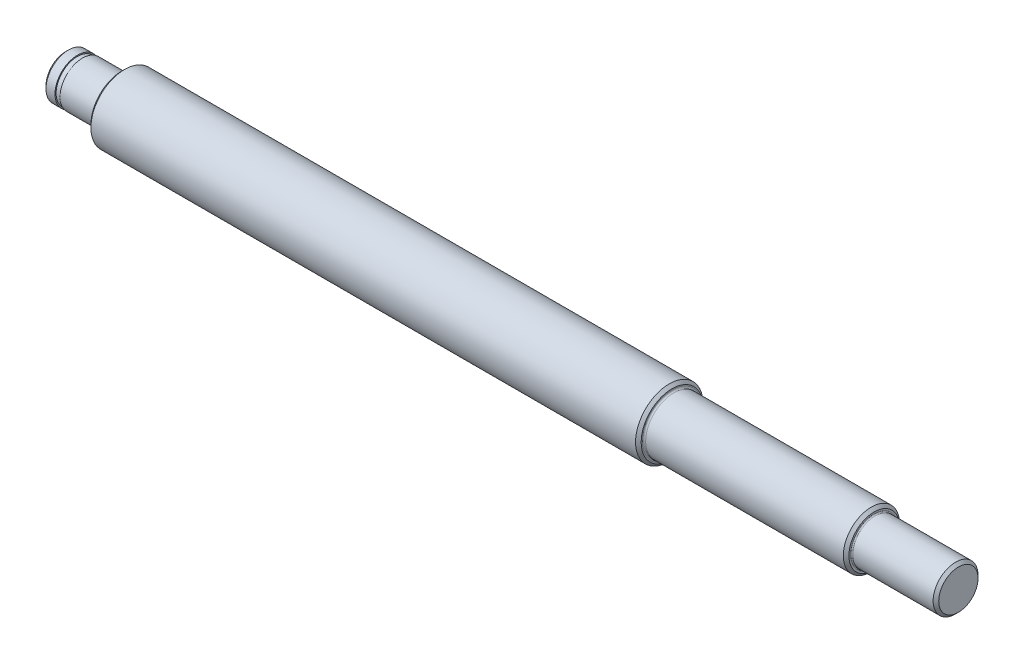
ISO-10303-21;
HEADER;
FILE_DESCRIPTION(('STEP AP214'),'2;1');
FILE_NAME('part.step','',(''),(''),'','','');
FILE_SCHEMA(('AUTOMOTIVE_DESIGN { 1 0 10303 214 1 1 1 1 }'));
ENDSEC;
DATA;
#1=APPLICATION_CONTEXT('core data for automotive mechanical design processes');
#2=APPLICATION_PROTOCOL_DEFINITION('international standard','automotive_design',2000,#1);
#3=PRODUCT_CONTEXT('',#1,'mechanical');
#4=PRODUCT('Part','Part','',(#3));
#5=PRODUCT_RELATED_PRODUCT_CATEGORY('part','',(#4));
#6=PRODUCT_DEFINITION_FORMATION('','',#4);
#7=PRODUCT_DEFINITION_CONTEXT('part definition',#1,'design');
#8=PRODUCT_DEFINITION('design','',#6,#7);
#9=PRODUCT_DEFINITION_SHAPE('','',#8);
#10=(LENGTH_UNIT() NAMED_UNIT(*) SI_UNIT(.MILLI.,.METRE.));
#11=(NAMED_UNIT(*) PLANE_ANGLE_UNIT() SI_UNIT($,.RADIAN.));
#12=(NAMED_UNIT(*) SI_UNIT($,.STERADIAN.) SOLID_ANGLE_UNIT());
#13=UNCERTAINTY_MEASURE_WITH_UNIT(LENGTH_MEASURE(1.E-05),#10,'distance_accuracy_value','');
#14=(GEOMETRIC_REPRESENTATION_CONTEXT(3) GLOBAL_UNCERTAINTY_ASSIGNED_CONTEXT((#13)) GLOBAL_UNIT_ASSIGNED_CONTEXT((#10,
#11,#12)) REPRESENTATION_CONTEXT('',''));
#15=CARTESIAN_POINT('',(0.,0.,0.));
#16=DIRECTION('',(0.,0.,1.));
#17=DIRECTION('',(1.,0.,0.));
#18=AXIS2_PLACEMENT_3D('',#15,#16,#17);
#19=CARTESIAN_POINT('',(0.500000000000004,0.,0.));
#20=DIRECTION('',(1.,0.,0.));
#21=DIRECTION('',(0.,0.,-1.));
#22=AXIS2_PLACEMENT_3D('',#19,#20,#21);
#23=CONICAL_SURFACE('',#22,4.,0.785398163397417);
#24=CARTESIAN_POINT('',(0.,0.,0.));
#25=DIRECTION('',(-1.,0.,0.));
#26=DIRECTION('',(0.,0.,1.));
#27=AXIS2_PLACEMENT_3D('',#24,#25,#26);
#28=CIRCLE('',#27,3.50000000000003);
#29=CARTESIAN_POINT('',(0.,0.,3.50000000000003));
#30=VERTEX_POINT('',#29);
#31=EDGE_CURVE('E105',#30,#30,#28,.T.);
#32=ORIENTED_EDGE('',*,*,#31,.F.);
#33=EDGE_LOOP('',(#32));
#34=FACE_BOUND('',#33,.T.);
#35=CARTESIAN_POINT('',(0.500000000000004,0.,0.));
#36=DIRECTION('',(-1.,0.,0.));
#37=DIRECTION('',(0.,0.,1.));
#38=AXIS2_PLACEMENT_3D('',#35,#36,#37);
#39=CIRCLE('',#38,4.);
#40=CARTESIAN_POINT('',(0.500000000000004,0.,4.));
#41=VERTEX_POINT('',#40);
#42=EDGE_CURVE('E10',#41,#41,#39,.T.);
#43=ORIENTED_EDGE('',*,*,#42,.T.);
#44=EDGE_LOOP('',(#43));
#45=FACE_BOUND('',#44,.T.);
#46=ADVANCED_FACE('F41',(#34,#45),#23,.T.);
#47=CARTESIAN_POINT('',(-7.49999999999999,0.,0.));
#48=DIRECTION('',(-1.,0.,0.));
#49=DIRECTION('',(0.,0.,1.));
#50=AXIS2_PLACEMENT_3D('',#47,#48,#49);
#51=CYLINDRICAL_SURFACE('',#50,4.);
#52=ORIENTED_EDGE('',*,*,#42,.F.);
#53=EDGE_LOOP('',(#52));
#54=FACE_BOUND('',#53,.T.);
#55=CARTESIAN_POINT('',(2.10000000000001,0.,0.));
#56=DIRECTION('',(-1.,0.,0.));
#57=DIRECTION('',(0.,0.,1.));
#58=AXIS2_PLACEMENT_3D('',#55,#56,#57);
#59=CIRCLE('',#58,4.);
#60=CARTESIAN_POINT('',(2.10000000000001,0.,4.));
#61=VERTEX_POINT('',#60);
#62=EDGE_CURVE('E47',#61,#61,#59,.T.);
#63=ORIENTED_EDGE('',*,*,#62,.T.);
#64=EDGE_LOOP('',(#63));
#65=FACE_BOUND('',#64,.T.);
#66=ADVANCED_FACE('F112',(#54,#65),#51,.T.);
#67=CARTESIAN_POINT('',(2.10000000000001,4.,0.));
#68=DIRECTION('',(-1.,0.,0.));
#69=DIRECTION('',(0.,0.,1.));
#70=AXIS2_PLACEMENT_3D('',#67,#68,#69);
#71=PLANE('',#70);
#72=ORIENTED_EDGE('',*,*,#62,.F.);
#73=EDGE_LOOP('',(#72));
#74=FACE_BOUND('',#73,.T.);
#75=CARTESIAN_POINT('',(2.10000000000001,0.,0.));
#76=DIRECTION('',(-1.,0.,0.));
#77=DIRECTION('',(0.,0.,1.));
#78=AXIS2_PLACEMENT_3D('',#75,#76,#77);
#79=CIRCLE('',#78,3.8);
#80=CARTESIAN_POINT('',(2.10000000000001,0.,3.8));
#81=VERTEX_POINT('',#80);
#82=EDGE_CURVE('E51',#81,#81,#79,.T.);
#83=ORIENTED_EDGE('',*,*,#82,.T.);
#84=EDGE_LOOP('',(#83));
#85=FACE_BOUND('',#84,.T.);
#86=ADVANCED_FACE('F116',(#74,#85),#71,.F.);
#87=CARTESIAN_POINT('',(-7.49999999999999,0.,0.));
#88=DIRECTION('',(-1.,0.,0.));
#89=DIRECTION('',(0.,0.,1.));
#90=AXIS2_PLACEMENT_3D('',#87,#88,#89);
#91=CYLINDRICAL_SURFACE('',#90,3.8);
#92=ORIENTED_EDGE('',*,*,#82,.F.);
#93=EDGE_LOOP('',(#92));
#94=FACE_BOUND('',#93,.T.);
#95=CARTESIAN_POINT('',(3.00000000000001,0.,0.));
#96=DIRECTION('',(-1.,0.,0.));
#97=DIRECTION('',(0.,0.,1.));
#98=AXIS2_PLACEMENT_3D('',#95,#96,#97);
#99=CIRCLE('',#98,3.8);
#100=CARTESIAN_POINT('',(3.00000000000001,0.,3.8));
#101=VERTEX_POINT('',#100);
#102=EDGE_CURVE('E55',#101,#101,#99,.T.);
#103=ORIENTED_EDGE('',*,*,#102,.T.);
#104=EDGE_LOOP('',(#103));
#105=FACE_BOUND('',#104,.T.);
#106=ADVANCED_FACE('F121',(#94,#105),#91,.T.);
#107=CARTESIAN_POINT('',(3.00000000000001,4.,0.));
#108=DIRECTION('',(1.,0.,0.));
#109=DIRECTION('',(0.,0.,-1.));
#110=AXIS2_PLACEMENT_3D('',#107,#108,#109);
#111=PLANE('',#110);
#112=ORIENTED_EDGE('',*,*,#102,.F.);
#113=EDGE_LOOP('',(#112));
#114=FACE_BOUND('',#113,.T.);
#115=CARTESIAN_POINT('',(3.00000000000001,0.,0.));
#116=DIRECTION('',(-1.,0.,0.));
#117=DIRECTION('',(0.,0.,1.));
#118=AXIS2_PLACEMENT_3D('',#115,#116,#117);
#119=CIRCLE('',#118,4.);
#120=CARTESIAN_POINT('',(3.00000000000001,0.,4.));
#121=VERTEX_POINT('',#120);
#122=EDGE_CURVE('E60',#121,#121,#119,.T.);
#123=ORIENTED_EDGE('',*,*,#122,.T.);
#124=EDGE_LOOP('',(#123));
#125=FACE_BOUND('',#124,.T.);
#126=ADVANCED_FACE('F127',(#114,#125),#111,.F.);
#127=CARTESIAN_POINT('',(-7.49999999999999,0.,0.));
#128=DIRECTION('',(-1.,0.,0.));
#129=DIRECTION('',(0.,0.,1.));
#130=AXIS2_PLACEMENT_3D('',#127,#128,#129);
#131=CYLINDRICAL_SURFACE('',#130,4.);
#132=ORIENTED_EDGE('',*,*,#122,.F.);
#133=EDGE_LOOP('',(#132));
#134=FACE_BOUND('',#133,.T.);
#135=CARTESIAN_POINT('',(9.70000000000001,0.,0.));
#136=DIRECTION('',(-1.,0.,0.));
#137=DIRECTION('',(0.,0.,1.));
#138=AXIS2_PLACEMENT_3D('',#135,#136,#137);
#139=CIRCLE('',#138,4.);
#140=CARTESIAN_POINT('',(9.70000000000001,0.,4.));
#141=VERTEX_POINT('',#140);
#142=EDGE_CURVE('E63',#141,#141,#139,.T.);
#143=ORIENTED_EDGE('',*,*,#142,.T.);
#144=EDGE_LOOP('',(#143));
#145=FACE_BOUND('',#144,.T.);
#146=ADVANCED_FACE('F131',(#134,#145),#131,.T.);
#147=CARTESIAN_POINT('',(9.70000000000001,0.,0.));
#148=DIRECTION('',(-1.,0.,0.));
#149=DIRECTION('',(0.,0.,1.));
#150=AXIS2_PLACEMENT_3D('',#147,#148,#149);
#151=TOROIDAL_SURFACE('',#150,4.3,0.3);
#152=ORIENTED_EDGE('',*,*,#142,.F.);
#153=EDGE_LOOP('',(#152));
#154=FACE_BOUND('',#153,.T.);
#155=CARTESIAN_POINT('',(10.,0.,0.));
#156=DIRECTION('',(-1.,0.,0.));
#157=DIRECTION('',(0.,0.,1.));
#158=AXIS2_PLACEMENT_3D('',#155,#156,#157);
#159=CIRCLE('',#158,4.3);
#160=CARTESIAN_POINT('',(10.,0.,4.3));
#161=VERTEX_POINT('',#160);
#162=EDGE_CURVE('E66',#161,#161,#159,.T.);
#163=ORIENTED_EDGE('',*,*,#162,.T.);
#164=EDGE_LOOP('',(#163));
#165=FACE_BOUND('',#164,.T.);
#166=ADVANCED_FACE('F135',(#154,#165),#151,.F.);
#167=CARTESIAN_POINT('',(10.,5.50000000000002,0.));
#168=DIRECTION('',(1.,0.,0.));
#169=DIRECTION('',(0.,0.,-1.));
#170=AXIS2_PLACEMENT_3D('',#167,#168,#169);
#171=PLANE('',#170);
#172=ORIENTED_EDGE('',*,*,#162,.F.);
#173=EDGE_LOOP('',(#172));
#174=FACE_BOUND('',#173,.T.);
#175=CARTESIAN_POINT('',(10.,0.,0.));
#176=DIRECTION('',(-1.,0.,0.));
#177=DIRECTION('',(0.,0.,1.));
#178=AXIS2_PLACEMENT_3D('',#175,#176,#177);
#179=CIRCLE('',#178,5.50000000000002);
#180=CARTESIAN_POINT('',(10.,0.,5.50000000000002));
#181=VERTEX_POINT('',#180);
#182=EDGE_CURVE('E69',#181,#181,#179,.T.);
#183=ORIENTED_EDGE('',*,*,#182,.T.);
#184=EDGE_LOOP('',(#183));
#185=FACE_BOUND('',#184,.T.);
#186=ADVANCED_FACE('F139',(#174,#185),#171,.F.);
#187=CARTESIAN_POINT('',(10.5,0.,0.));
#188=DIRECTION('',(1.,0.,0.));
#189=DIRECTION('',(0.,0.,-1.));
#190=AXIS2_PLACEMENT_3D('',#187,#188,#189);
#191=CONICAL_SURFACE('',#190,5.99999999999999,0.785398163397423);
#192=ORIENTED_EDGE('',*,*,#182,.F.);
#193=EDGE_LOOP('',(#192));
#194=FACE_BOUND('',#193,.T.);
#195=CARTESIAN_POINT('',(10.5,0.,0.));
#196=DIRECTION('',(-1.,0.,0.));
#197=DIRECTION('',(0.,0.,1.));
#198=AXIS2_PLACEMENT_3D('',#195,#196,#197);
#199=CIRCLE('',#198,5.99999999999999);
#200=CARTESIAN_POINT('',(10.5,0.,5.99999999999999));
#201=VERTEX_POINT('',#200);
#202=EDGE_CURVE('E72',#201,#201,#199,.T.);
#203=ORIENTED_EDGE('',*,*,#202,.T.);
#204=EDGE_LOOP('',(#203));
#205=FACE_BOUND('',#204,.T.);
#206=ADVANCED_FACE('F143',(#194,#205),#191,.T.);
#207=CARTESIAN_POINT('',(-7.49999999999999,0.,0.));
#208=DIRECTION('',(-1.,0.,0.));
#209=DIRECTION('',(0.,0.,1.));
#210=AXIS2_PLACEMENT_3D('',#207,#208,#209);
#211=CYLINDRICAL_SURFACE('',#210,6.00000000000001);
#212=ORIENTED_EDGE('',*,*,#202,.F.);
#213=EDGE_LOOP('',(#212));
#214=FACE_BOUND('',#213,.T.);
#215=CARTESIAN_POINT('',(107.5,0.,0.));
#216=DIRECTION('',(-1.,0.,0.));
#217=DIRECTION('',(0.,0.,1.));
#218=AXIS2_PLACEMENT_3D('',#215,#216,#217);
#219=CIRCLE('',#218,6.00000000000002);
#220=CARTESIAN_POINT('',(107.5,0.,6.00000000000002));
#221=VERTEX_POINT('',#220);
#222=EDGE_CURVE('E75',#221,#221,#219,.T.);
#223=ORIENTED_EDGE('',*,*,#222,.T.);
#224=EDGE_LOOP('',(#223));
#225=FACE_BOUND('',#224,.T.);
#226=ADVANCED_FACE('F147',(#214,#225),#211,.T.);
#227=CARTESIAN_POINT('',(108.,0.,0.));
#228=DIRECTION('',(-1.,0.,0.));
#229=DIRECTION('',(0.,0.,1.));
#230=AXIS2_PLACEMENT_3D('',#227,#228,#229);
#231=CONICAL_SURFACE('',#230,5.49999999999999,0.785398163397479);
#232=ORIENTED_EDGE('',*,*,#222,.F.);
#233=EDGE_LOOP('',(#232));
#234=FACE_BOUND('',#233,.T.);
#235=CARTESIAN_POINT('',(108.,0.,0.));
#236=DIRECTION('',(-1.,0.,0.));
#237=DIRECTION('',(0.,0.,1.));
#238=AXIS2_PLACEMENT_3D('',#235,#236,#237);
#239=CIRCLE('',#238,5.49999999999999);
#240=CARTESIAN_POINT('',(108.,0.,5.49999999999999));
#241=VERTEX_POINT('',#240);
#242=EDGE_CURVE('E78',#241,#241,#239,.T.);
#243=ORIENTED_EDGE('',*,*,#242,.T.);
#244=EDGE_LOOP('',(#243));
#245=FACE_BOUND('',#244,.T.);
#246=ADVANCED_FACE('F151',(#234,#245),#231,.T.);
#247=CARTESIAN_POINT('',(108.,5.30000000000001,0.));
#248=DIRECTION('',(-1.,0.,0.));
#249=DIRECTION('',(0.,0.,1.));
#250=AXIS2_PLACEMENT_3D('',#247,#248,#249);
#251=PLANE('',#250);
#252=ORIENTED_EDGE('',*,*,#242,.F.);
#253=EDGE_LOOP('',(#252));
#254=FACE_BOUND('',#253,.T.);
#255=CARTESIAN_POINT('',(108.,0.,0.));
#256=DIRECTION('',(-1.,0.,0.));
#257=DIRECTION('',(0.,0.,1.));
#258=AXIS2_PLACEMENT_3D('',#255,#256,#257);
#259=CIRCLE('',#258,5.30000000000001);
#260=CARTESIAN_POINT('',(108.,0.,5.30000000000001));
#261=VERTEX_POINT('',#260);
#262=EDGE_CURVE('E81',#261,#261,#259,.T.);
#263=ORIENTED_EDGE('',*,*,#262,.T.);
#264=EDGE_LOOP('',(#263));
#265=FACE_BOUND('',#264,.T.);
#266=ADVANCED_FACE('F155',(#254,#265),#251,.F.);
#267=CARTESIAN_POINT('',(108.3,0.,0.));
#268=DIRECTION('',(-1.,0.,0.));
#269=DIRECTION('',(0.,0.,1.));
#270=AXIS2_PLACEMENT_3D('',#267,#268,#269);
#271=TOROIDAL_SURFACE('',#270,5.30000000000001,0.299999999999998);
#272=ORIENTED_EDGE('',*,*,#262,.F.);
#273=EDGE_LOOP('',(#272));
#274=FACE_BOUND('',#273,.T.);
#275=CARTESIAN_POINT('',(108.3,0.,0.));
#276=DIRECTION('',(-1.,0.,0.));
#277=DIRECTION('',(0.,0.,1.));
#278=AXIS2_PLACEMENT_3D('',#275,#276,#277);
#279=CIRCLE('',#278,5.00000000000001);
#280=CARTESIAN_POINT('',(108.3,0.,5.00000000000001));
#281=VERTEX_POINT('',#280);
#282=EDGE_CURVE('E84',#281,#281,#279,.T.);
#283=ORIENTED_EDGE('',*,*,#282,.T.);
#284=EDGE_LOOP('',(#283));
#285=FACE_BOUND('',#284,.T.);
#286=ADVANCED_FACE('F159',(#274,#285),#271,.F.);
#287=CARTESIAN_POINT('',(-7.49999999999999,0.,0.));
#288=DIRECTION('',(-1.,0.,0.));
#289=DIRECTION('',(0.,0.,1.));
#290=AXIS2_PLACEMENT_3D('',#287,#288,#289);
#291=CYLINDRICAL_SURFACE('',#290,5.00000000000003);
#292=ORIENTED_EDGE('',*,*,#282,.F.);
#293=EDGE_LOOP('',(#292));
#294=FACE_BOUND('',#293,.T.);
#295=CARTESIAN_POINT('',(143.5,0.,0.));
#296=DIRECTION('',(-1.,0.,0.));
#297=DIRECTION('',(0.,0.,1.));
#298=AXIS2_PLACEMENT_3D('',#295,#296,#297);
#299=CIRCLE('',#298,5.00000000000004);
#300=CARTESIAN_POINT('',(143.5,0.,5.00000000000004));
#301=VERTEX_POINT('',#300);
#302=EDGE_CURVE('E87',#301,#301,#299,.T.);
#303=ORIENTED_EDGE('',*,*,#302,.T.);
#304=EDGE_LOOP('',(#303));
#305=FACE_BOUND('',#304,.T.);
#306=ADVANCED_FACE('F163',(#294,#305),#291,.T.);
#307=CARTESIAN_POINT('',(144.,0.,0.));
#308=DIRECTION('',(-1.,0.,0.));
#309=DIRECTION('',(0.,0.,1.));
#310=AXIS2_PLACEMENT_3D('',#307,#308,#309);
#311=CONICAL_SURFACE('',#310,4.50000000000001,0.785398163397482);
#312=ORIENTED_EDGE('',*,*,#302,.F.);
#313=EDGE_LOOP('',(#312));
#314=FACE_BOUND('',#313,.T.);
#315=CARTESIAN_POINT('',(144.,0.,0.));
#316=DIRECTION('',(-1.,0.,0.));
#317=DIRECTION('',(0.,0.,1.));
#318=AXIS2_PLACEMENT_3D('',#315,#316,#317);
#319=CIRCLE('',#318,4.50000000000001);
#320=CARTESIAN_POINT('',(144.,0.,4.50000000000001));
#321=VERTEX_POINT('',#320);
#322=EDGE_CURVE('E90',#321,#321,#319,.T.);
#323=ORIENTED_EDGE('',*,*,#322,.T.);
#324=EDGE_LOOP('',(#323));
#325=FACE_BOUND('',#324,.T.);
#326=ADVANCED_FACE('F167',(#314,#325),#311,.T.);
#327=CARTESIAN_POINT('',(144.,4.20000000000002,0.));
#328=DIRECTION('',(-1.,0.,0.));
#329=DIRECTION('',(0.,0.,1.));
#330=AXIS2_PLACEMENT_3D('',#327,#328,#329);
#331=PLANE('',#330);
#332=ORIENTED_EDGE('',*,*,#322,.F.);
#333=EDGE_LOOP('',(#332));
#334=FACE_BOUND('',#333,.T.);
#335=CARTESIAN_POINT('',(144.,0.,0.));
#336=DIRECTION('',(-1.,0.,0.));
#337=DIRECTION('',(0.,0.,1.));
#338=AXIS2_PLACEMENT_3D('',#335,#336,#337);
#339=CIRCLE('',#338,4.20000000000002);
#340=CARTESIAN_POINT('',(144.,0.,4.20000000000002));
#341=VERTEX_POINT('',#340);
#342=EDGE_CURVE('E93',#341,#341,#339,.T.);
#343=ORIENTED_EDGE('',*,*,#342,.T.);
#344=EDGE_LOOP('',(#343));
#345=FACE_BOUND('',#344,.T.);
#346=ADVANCED_FACE('F171',(#334,#345),#331,.F.);
#347=CARTESIAN_POINT('',(144.2,0.,0.));
#348=DIRECTION('',(-1.,0.,0.));
#349=DIRECTION('',(0.,0.,1.));
#350=AXIS2_PLACEMENT_3D('',#347,#348,#349);
#351=TOROIDAL_SURFACE('',#350,4.20000000000002,0.200000000000002);
#352=ORIENTED_EDGE('',*,*,#342,.F.);
#353=EDGE_LOOP('',(#352));
#354=FACE_BOUND('',#353,.T.);
#355=CARTESIAN_POINT('',(144.2,0.,0.));
#356=DIRECTION('',(-1.,0.,0.));
#357=DIRECTION('',(0.,0.,1.));
#358=AXIS2_PLACEMENT_3D('',#355,#356,#357);
#359=CIRCLE('',#358,4.00000000000002);
#360=CARTESIAN_POINT('',(144.2,0.,4.00000000000002));
#361=VERTEX_POINT('',#360);
#362=EDGE_CURVE('E96',#361,#361,#359,.T.);
#363=ORIENTED_EDGE('',*,*,#362,.T.);
#364=EDGE_LOOP('',(#363));
#365=FACE_BOUND('',#364,.T.);
#366=ADVANCED_FACE('F175',(#354,#365),#351,.F.);
#367=CARTESIAN_POINT('',(-7.49999999999999,0.,0.));
#368=DIRECTION('',(-1.,0.,0.));
#369=DIRECTION('',(0.,0.,1.));
#370=AXIS2_PLACEMENT_3D('',#367,#368,#369);
#371=CYLINDRICAL_SURFACE('',#370,4.00000000000003);
#372=ORIENTED_EDGE('',*,*,#362,.F.);
#373=EDGE_LOOP('',(#372));
#374=FACE_BOUND('',#373,.T.);
#375=CARTESIAN_POINT('',(158.5,0.,0.));
#376=DIRECTION('',(-1.,0.,0.));
#377=DIRECTION('',(0.,0.,1.));
#378=AXIS2_PLACEMENT_3D('',#375,#376,#377);
#379=CIRCLE('',#378,4.00000000000003);
#380=CARTESIAN_POINT('',(158.5,0.,4.00000000000003));
#381=VERTEX_POINT('',#380);
#382=EDGE_CURVE('E99',#381,#381,#379,.T.);
#383=ORIENTED_EDGE('',*,*,#382,.T.);
#384=EDGE_LOOP('',(#383));
#385=FACE_BOUND('',#384,.T.);
#386=ADVANCED_FACE('F179',(#374,#385),#371,.T.);
#387=CARTESIAN_POINT('',(159.,0.,0.));
#388=DIRECTION('',(-1.,0.,0.));
#389=DIRECTION('',(0.,0.,1.));
#390=AXIS2_PLACEMENT_3D('',#387,#388,#389);
#391=CONICAL_SURFACE('',#390,3.50000000000001,0.785398163397466);
#392=ORIENTED_EDGE('',*,*,#382,.F.);
#393=EDGE_LOOP('',(#392));
#394=FACE_BOUND('',#393,.T.);
#395=CARTESIAN_POINT('',(159.,0.,0.));
#396=DIRECTION('',(-1.,0.,0.));
#397=DIRECTION('',(0.,0.,1.));
#398=AXIS2_PLACEMENT_3D('',#395,#396,#397);
#399=CIRCLE('',#398,3.50000000000001);
#400=CARTESIAN_POINT('',(159.,0.,3.50000000000001));
#401=VERTEX_POINT('',#400);
#402=EDGE_CURVE('E102',#401,#401,#399,.T.);
#403=ORIENTED_EDGE('',*,*,#402,.T.);
#404=EDGE_LOOP('',(#403));
#405=FACE_BOUND('',#404,.T.);
#406=ADVANCED_FACE('F183',(#394,#405),#391,.T.);
#407=CARTESIAN_POINT('',(159.,0.,0.));
#408=DIRECTION('',(-1.,0.,0.));
#409=DIRECTION('',(0.,0.,1.));
#410=AXIS2_PLACEMENT_3D('',#407,#408,#409);
#411=PLANE('',#410);
#412=ORIENTED_EDGE('',*,*,#402,.F.);
#413=EDGE_LOOP('',(#412));
#414=FACE_BOUND('',#413,.T.);
#415=ADVANCED_FACE('F187',(#414),#411,.F.);
#416=CARTESIAN_POINT('',(0.,3.50000000000003,0.));
#417=DIRECTION('',(1.,0.,0.));
#418=DIRECTION('',(0.,0.,-1.));
#419=AXIS2_PLACEMENT_3D('',#416,#417,#418);
#420=PLANE('',#419);
#421=ORIENTED_EDGE('',*,*,#31,.T.);
#422=EDGE_LOOP('',(#421));
#423=FACE_BOUND('',#422,.T.);
#424=ADVANCED_FACE('F109',(#423),#420,.F.);
#425=CLOSED_SHELL('',(#46,#66,#86,#106,#126,#146,#166,#186,#206,#226,#246,#266,#286,#306,#326,
#346,#366,#386,#406,#415,#424));
#426=MANIFOLD_SOLID_BREP('B2',#425);
#427=ADVANCED_BREP_SHAPE_REPRESENTATION('',(#18,#426),#14);
#428=SHAPE_DEFINITION_REPRESENTATION(#9,#427);
ENDSEC;
END-ISO-10303-21;
